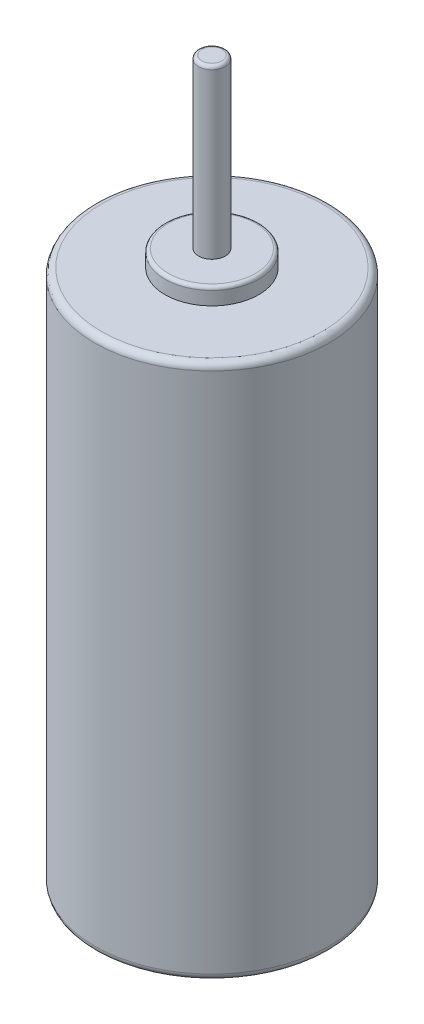
ISO-10303-21;
HEADER;
FILE_DESCRIPTION(('STEP AP214'),'2;1');
FILE_NAME('part.step','',(''),(''),'','','');
FILE_SCHEMA(('AUTOMOTIVE_DESIGN { 1 0 10303 214 1 1 1 1 }'));
ENDSEC;
DATA;
#1=APPLICATION_CONTEXT('core data for automotive mechanical design processes');
#2=APPLICATION_PROTOCOL_DEFINITION('international standard','automotive_design',2000,#1);
#3=PRODUCT_CONTEXT('',#1,'mechanical');
#4=PRODUCT('Part','Part','',(#3));
#5=PRODUCT_RELATED_PRODUCT_CATEGORY('part','',(#4));
#6=PRODUCT_DEFINITION_FORMATION('','',#4);
#7=PRODUCT_DEFINITION_CONTEXT('part definition',#1,'design');
#8=PRODUCT_DEFINITION('design','',#6,#7);
#9=PRODUCT_DEFINITION_SHAPE('','',#8);
#10=(LENGTH_UNIT() NAMED_UNIT(*) SI_UNIT(.MILLI.,.METRE.));
#11=(NAMED_UNIT(*) PLANE_ANGLE_UNIT() SI_UNIT($,.RADIAN.));
#12=(NAMED_UNIT(*) SI_UNIT($,.STERADIAN.) SOLID_ANGLE_UNIT());
#13=UNCERTAINTY_MEASURE_WITH_UNIT(LENGTH_MEASURE(1.E-05),#10,'distance_accuracy_value','');
#14=(GEOMETRIC_REPRESENTATION_CONTEXT(3) GLOBAL_UNCERTAINTY_ASSIGNED_CONTEXT((#13)) GLOBAL_UNIT_ASSIGNED_CONTEXT((#10,
#11,#12)) REPRESENTATION_CONTEXT('',''));
#15=CARTESIAN_POINT('',(0.,0.,0.));
#16=DIRECTION('',(0.,0.,1.));
#17=DIRECTION('',(1.,0.,0.));
#18=AXIS2_PLACEMENT_3D('',#15,#16,#17);
#19=CARTESIAN_POINT('',(0.,16.4,0.));
#20=DIRECTION('',(0.,1.,0.));
#21=DIRECTION('',(0.,0.,1.));
#22=AXIS2_PLACEMENT_3D('',#19,#20,#21);
#23=TOROIDAL_SURFACE('',#22,1.3,0.1);
#24=CARTESIAN_POINT('',(0.,16.5,0.));
#25=DIRECTION('',(0.,1.,0.));
#26=DIRECTION('',(0.,0.,1.));
#27=AXIS2_PLACEMENT_3D('',#24,#25,#26);
#28=CIRCLE('',#27,1.3);
#29=CARTESIAN_POINT('',(0.,16.5,1.3));
#30=VERTEX_POINT('',#29);
#31=EDGE_CURVE('E42',#30,#30,#28,.T.);
#32=ORIENTED_EDGE('',*,*,#31,.F.);
#33=EDGE_LOOP('',(#32));
#34=FACE_BOUND('',#33,.T.);
#35=CARTESIAN_POINT('',(0.,16.4,0.));
#36=DIRECTION('',(0.,1.,0.));
#37=DIRECTION('',(0.,0.,1.));
#38=AXIS2_PLACEMENT_3D('',#35,#36,#37);
#39=CIRCLE('',#38,1.4);
#40=CARTESIAN_POINT('',(0.,16.4,1.4));
#41=VERTEX_POINT('',#40);
#42=EDGE_CURVE('E10',#41,#41,#39,.F.);
#43=ORIENTED_EDGE('',*,*,#42,.F.);
#44=EDGE_LOOP('',(#43));
#45=FACE_BOUND('',#44,.T.);
#46=ADVANCED_FACE('F35',(#34,#45),#23,.T.);
#47=CARTESIAN_POINT('',(0.,0.199999999999999,0.));
#48=DIRECTION('',(0.,1.,0.));
#49=DIRECTION('',(0.,0.,1.));
#50=AXIS2_PLACEMENT_3D('',#47,#48,#49);
#51=TOROIDAL_SURFACE('',#50,3.3,0.2);
#52=CARTESIAN_POINT('',(0.,0.,0.));
#53=DIRECTION('',(0.,1.,0.));
#54=DIRECTION('',(0.,0.,1.));
#55=AXIS2_PLACEMENT_3D('',#52,#53,#54);
#56=CIRCLE('',#55,3.3);
#57=CARTESIAN_POINT('',(0.,0.,3.3));
#58=VERTEX_POINT('',#57);
#59=EDGE_CURVE('E54',#58,#58,#56,.F.);
#60=ORIENTED_EDGE('',*,*,#59,.F.);
#61=EDGE_LOOP('',(#60));
#62=FACE_BOUND('',#61,.T.);
#63=CARTESIAN_POINT('',(0.,0.199999999999999,0.));
#64=DIRECTION('',(0.,1.,0.));
#65=DIRECTION('',(0.,0.,1.));
#66=AXIS2_PLACEMENT_3D('',#63,#64,#65);
#67=CIRCLE('',#66,3.5);
#68=CARTESIAN_POINT('',(0.,0.199999999999999,3.5));
#69=VERTEX_POINT('',#68);
#70=EDGE_CURVE('E48',#69,#69,#67,.T.);
#71=ORIENTED_EDGE('',*,*,#70,.F.);
#72=EDGE_LOOP('',(#71));
#73=FACE_BOUND('',#72,.T.);
#74=ADVANCED_FACE('F99',(#62,#73),#51,.T.);
#75=CARTESIAN_POINT('',(0.,15.8,0.));
#76=DIRECTION('',(0.,1.,0.));
#77=DIRECTION('',(0.,0.,1.));
#78=AXIS2_PLACEMENT_3D('',#75,#76,#77);
#79=TOROIDAL_SURFACE('',#78,3.3,0.2);
#80=CARTESIAN_POINT('',(0.,16.,0.));
#81=DIRECTION('',(0.,1.,0.));
#82=DIRECTION('',(0.,0.,1.));
#83=AXIS2_PLACEMENT_3D('',#80,#81,#82);
#84=CIRCLE('',#83,3.3);
#85=CARTESIAN_POINT('',(0.,16.,3.3));
#86=VERTEX_POINT('',#85);
#87=EDGE_CURVE('E63',#86,#86,#84,.T.);
#88=ORIENTED_EDGE('',*,*,#87,.F.);
#89=EDGE_LOOP('',(#88));
#90=FACE_BOUND('',#89,.T.);
#91=CARTESIAN_POINT('',(0.,15.8,0.));
#92=DIRECTION('',(0.,1.,0.));
#93=DIRECTION('',(0.,0.,1.));
#94=AXIS2_PLACEMENT_3D('',#91,#92,#93);
#95=CIRCLE('',#94,3.5);
#96=CARTESIAN_POINT('',(0.,15.8,3.5));
#97=VERTEX_POINT('',#96);
#98=EDGE_CURVE('E60',#97,#97,#95,.F.);
#99=ORIENTED_EDGE('',*,*,#98,.F.);
#100=EDGE_LOOP('',(#99));
#101=FACE_BOUND('',#100,.T.);
#102=ADVANCED_FACE('F104',(#90,#101),#79,.T.);
#103=CARTESIAN_POINT('',(0.,21.4,0.));
#104=DIRECTION('',(0.,1.,0.));
#105=DIRECTION('',(0.,0.,1.));
#106=AXIS2_PLACEMENT_3D('',#103,#104,#105);
#107=TOROIDAL_SURFACE('',#106,0.3,0.1);
#108=CARTESIAN_POINT('',(0.,21.5,0.));
#109=DIRECTION('',(0.,1.,0.));
#110=DIRECTION('',(0.,0.,1.));
#111=AXIS2_PLACEMENT_3D('',#108,#109,#110);
#112=CIRCLE('',#111,0.3);
#113=CARTESIAN_POINT('',(0.,21.5,0.3));
#114=VERTEX_POINT('',#113);
#115=EDGE_CURVE('E71',#114,#114,#112,.T.);
#116=ORIENTED_EDGE('',*,*,#115,.F.);
#117=EDGE_LOOP('',(#116));
#118=FACE_BOUND('',#117,.T.);
#119=CARTESIAN_POINT('',(0.,21.4,0.));
#120=DIRECTION('',(0.,1.,0.));
#121=DIRECTION('',(0.,0.,1.));
#122=AXIS2_PLACEMENT_3D('',#119,#120,#121);
#123=CIRCLE('',#122,0.4);
#124=CARTESIAN_POINT('',(0.,21.4,0.4));
#125=VERTEX_POINT('',#124);
#126=EDGE_CURVE('E67',#125,#125,#123,.F.);
#127=ORIENTED_EDGE('',*,*,#126,.F.);
#128=EDGE_LOOP('',(#127));
#129=FACE_BOUND('',#128,.T.);
#130=ADVANCED_FACE('F110',(#118,#129),#107,.T.);
#131=CARTESIAN_POINT('',(0.,16.,0.));
#132=DIRECTION('',(0.,-1.,0.));
#133=DIRECTION('',(0.,0.,-1.));
#134=AXIS2_PLACEMENT_3D('',#131,#132,#133);
#135=CYLINDRICAL_SURFACE('',#134,3.5);
#136=ORIENTED_EDGE('',*,*,#70,.T.);
#137=EDGE_LOOP('',(#136));
#138=FACE_BOUND('',#137,.T.);
#139=ORIENTED_EDGE('',*,*,#98,.T.);
#140=EDGE_LOOP('',(#139));
#141=FACE_BOUND('',#140,.T.);
#142=ADVANCED_FACE('F118',(#138,#141),#135,.T.);
#143=CARTESIAN_POINT('',(0.,16.,0.));
#144=DIRECTION('',(0.,1.,0.));
#145=DIRECTION('',(0.,0.,1.));
#146=AXIS2_PLACEMENT_3D('',#143,#144,#145);
#147=PLANE('',#146);
#148=ORIENTED_EDGE('',*,*,#87,.T.);
#149=EDGE_LOOP('',(#148));
#150=FACE_BOUND('',#149,.T.);
#151=CARTESIAN_POINT('',(0.,16.,0.));
#152=DIRECTION('',(0.,1.,0.));
#153=DIRECTION('',(0.,0.,1.));
#154=AXIS2_PLACEMENT_3D('',#151,#152,#153);
#155=CIRCLE('',#154,1.4);
#156=CARTESIAN_POINT('',(0.,16.,1.4));
#157=VERTEX_POINT('',#156);
#158=EDGE_CURVE('E75',#157,#157,#155,.T.);
#159=ORIENTED_EDGE('',*,*,#158,.F.);
#160=EDGE_LOOP('',(#159));
#161=FACE_BOUND('',#160,.T.);
#162=ADVANCED_FACE('F122',(#150,#161),#147,.T.);
#163=CARTESIAN_POINT('',(0.,0.,0.));
#164=DIRECTION('',(0.,1.,0.));
#165=DIRECTION('',(0.,0.,1.));
#166=AXIS2_PLACEMENT_3D('',#163,#164,#165);
#167=PLANE('',#166);
#168=ORIENTED_EDGE('',*,*,#59,.T.);
#169=EDGE_LOOP('',(#168));
#170=FACE_BOUND('',#169,.T.);
#171=ADVANCED_FACE('F96',(#170),#167,.F.);
#172=CARTESIAN_POINT('',(0.,16.5,0.));
#173=DIRECTION('',(0.,-1.,0.));
#174=DIRECTION('',(0.,0.,-1.));
#175=AXIS2_PLACEMENT_3D('',#172,#173,#174);
#176=CYLINDRICAL_SURFACE('',#175,1.4);
#177=ORIENTED_EDGE('',*,*,#42,.T.);
#178=EDGE_LOOP('',(#177));
#179=FACE_BOUND('',#178,.T.);
#180=ORIENTED_EDGE('',*,*,#158,.T.);
#181=EDGE_LOOP('',(#180));
#182=FACE_BOUND('',#181,.T.);
#183=ADVANCED_FACE('F87',(#179,#182),#176,.T.);
#184=CARTESIAN_POINT('',(0.,16.5,0.));
#185=DIRECTION('',(0.,1.,0.));
#186=DIRECTION('',(0.,0.,1.));
#187=AXIS2_PLACEMENT_3D('',#184,#185,#186);
#188=PLANE('',#187);
#189=ORIENTED_EDGE('',*,*,#31,.T.);
#190=EDGE_LOOP('',(#189));
#191=FACE_BOUND('',#190,.T.);
#192=CARTESIAN_POINT('',(0.,16.5,0.));
#193=DIRECTION('',(0.,1.,0.));
#194=DIRECTION('',(0.,0.,1.));
#195=AXIS2_PLACEMENT_3D('',#192,#193,#194);
#196=CIRCLE('',#195,0.4);
#197=CARTESIAN_POINT('',(0.,16.5,0.4));
#198=VERTEX_POINT('',#197);
#199=EDGE_CURVE('E74',#198,#198,#196,.T.);
#200=ORIENTED_EDGE('',*,*,#199,.F.);
#201=EDGE_LOOP('',(#200));
#202=FACE_BOUND('',#201,.T.);
#203=ADVANCED_FACE('F85',(#191,#202),#188,.T.);
#204=CARTESIAN_POINT('',(0.,21.5,0.));
#205=DIRECTION('',(0.,-1.,0.));
#206=DIRECTION('',(0.,0.,-1.));
#207=AXIS2_PLACEMENT_3D('',#204,#205,#206);
#208=CYLINDRICAL_SURFACE('',#207,0.4);
#209=ORIENTED_EDGE('',*,*,#126,.T.);
#210=EDGE_LOOP('',(#209));
#211=FACE_BOUND('',#210,.T.);
#212=ORIENTED_EDGE('',*,*,#199,.T.);
#213=EDGE_LOOP('',(#212));
#214=FACE_BOUND('',#213,.T.);
#215=ADVANCED_FACE('F83',(#211,#214),#208,.T.);
#216=CARTESIAN_POINT('',(0.,21.5,0.));
#217=DIRECTION('',(0.,1.,0.));
#218=DIRECTION('',(0.,0.,1.));
#219=AXIS2_PLACEMENT_3D('',#216,#217,#218);
#220=PLANE('',#219);
#221=ORIENTED_EDGE('',*,*,#115,.T.);
#222=EDGE_LOOP('',(#221));
#223=FACE_BOUND('',#222,.T.);
#224=ADVANCED_FACE('F93',(#223),#220,.T.);
#225=CLOSED_SHELL('',(#46,#74,#102,#130,#142,#162,#171,#183,#203,#215,#224));
#226=MANIFOLD_SOLID_BREP('B2',#225);
#227=ADVANCED_BREP_SHAPE_REPRESENTATION('',(#18,#226),#14);
#228=SHAPE_DEFINITION_REPRESENTATION(#9,#227);
ENDSEC;
END-ISO-10303-21;
